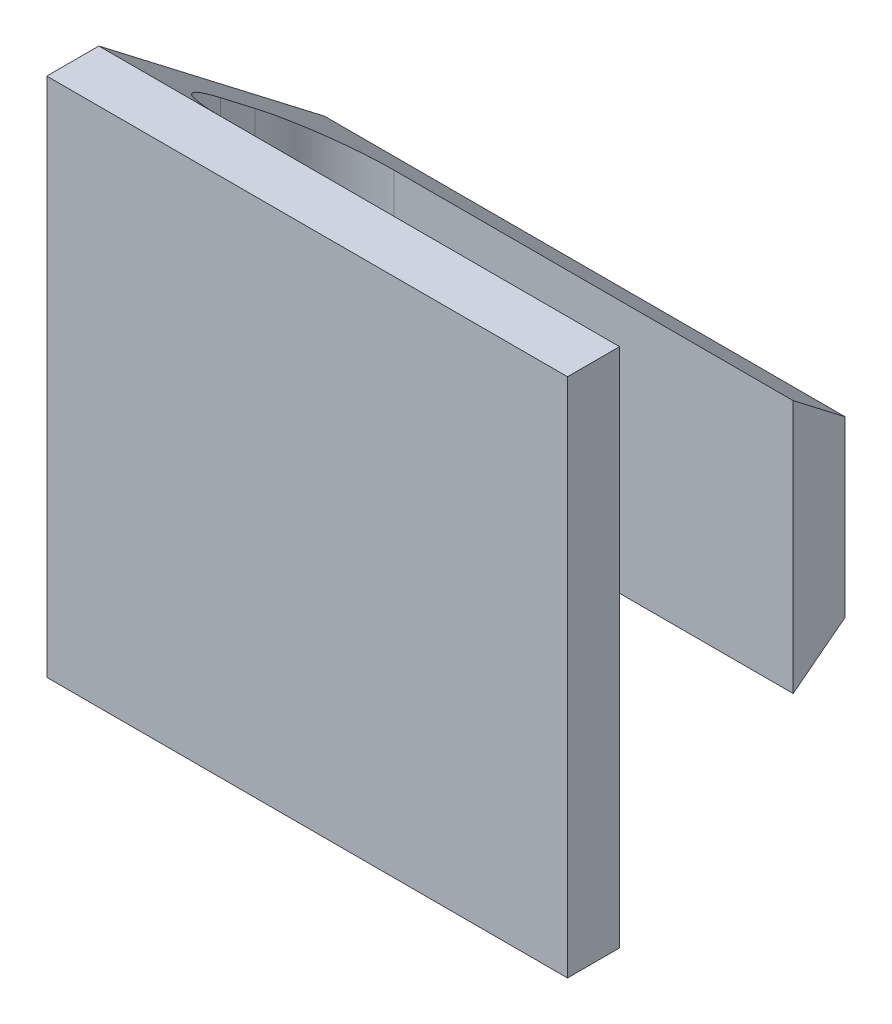
ISO-10303-21;
HEADER;
FILE_DESCRIPTION(('STEP AP214'),'2;1');
FILE_NAME('part.step','',(''),(''),'','','');
FILE_SCHEMA(('AUTOMOTIVE_DESIGN { 1 0 10303 214 1 1 1 1 }'));
ENDSEC;
DATA;
#1=APPLICATION_CONTEXT('core data for automotive mechanical design processes');
#2=APPLICATION_PROTOCOL_DEFINITION('international standard','automotive_design',2000,#1);
#3=PRODUCT_CONTEXT('',#1,'mechanical');
#4=PRODUCT('Part','Part','',(#3));
#5=PRODUCT_RELATED_PRODUCT_CATEGORY('part','',(#4));
#6=PRODUCT_DEFINITION_FORMATION('','',#4);
#7=PRODUCT_DEFINITION_CONTEXT('part definition',#1,'design');
#8=PRODUCT_DEFINITION('design','',#6,#7);
#9=PRODUCT_DEFINITION_SHAPE('','',#8);
#10=(LENGTH_UNIT() NAMED_UNIT(*) SI_UNIT(.MILLI.,.METRE.));
#11=(NAMED_UNIT(*) PLANE_ANGLE_UNIT() SI_UNIT($,.RADIAN.));
#12=(NAMED_UNIT(*) SI_UNIT($,.STERADIAN.) SOLID_ANGLE_UNIT());
#13=UNCERTAINTY_MEASURE_WITH_UNIT(LENGTH_MEASURE(1.E-05),#10,'distance_accuracy_value','');
#14=(GEOMETRIC_REPRESENTATION_CONTEXT(3) GLOBAL_UNCERTAINTY_ASSIGNED_CONTEXT((#13)) GLOBAL_UNIT_ASSIGNED_CONTEXT((#10,
#11,#12)) REPRESENTATION_CONTEXT('',''));
#15=CARTESIAN_POINT('',(0.,0.,0.));
#16=DIRECTION('',(0.,0.,1.));
#17=DIRECTION('',(1.,0.,0.));
#18=AXIS2_PLACEMENT_3D('',#15,#16,#17);
#19=CARTESIAN_POINT('',(-6.77549194991055,15.,3.18604651162791));
#20=DIRECTION('',(1.,0.,0.));
#21=DIRECTION('',(0.,0.,-1.));
#22=AXIS2_PLACEMENT_3D('',#19,#20,#21);
#23=PLANE('',#22);
#24=DIRECTION('',(0.,0.609710760849692,0.7926239891046));
#25=VECTOR('',#24,1.);
#26=CARTESIAN_POINT('',(-6.77549194991055,15.,3.18604651162791));
#27=LINE('',#26,#25);
#28=CARTESIAN_POINT('',(-6.77549194991055,10.,-3.31395348837209));
#29=VERTEX_POINT('',#28);
#30=CARTESIAN_POINT('',(-6.77549194991055,15.,3.18604651162791));
#31=VERTEX_POINT('',#30);
#32=EDGE_CURVE('E46',#29,#31,#27,.T.);
#33=ORIENTED_EDGE('',*,*,#32,.F.);
#34=DIRECTION('',(0.,-1.,0.));
#35=VECTOR('',#34,1.);
#36=CARTESIAN_POINT('',(-6.77549194991055,15.,-3.31395348837209));
#37=LINE('',#36,#35);
#38=CARTESIAN_POINT('',(-6.77549194991055,5.,-3.31395348837209));
#39=VERTEX_POINT('',#38);
#40=EDGE_CURVE('E133',#29,#39,#37,.T.);
#41=ORIENTED_EDGE('',*,*,#40,.T.);
#42=DIRECTION('',(0.,0.609710760849692,-0.7926239891046));
#43=VECTOR('',#42,1.);
#44=CARTESIAN_POINT('',(-6.77549194991055,5.57620817843866,-4.06302412034235));
#45=LINE('',#44,#43);
#46=CARTESIAN_POINT('',(-6.77549194991055,0.,3.18604651162791));
#47=VERTEX_POINT('',#46);
#48=EDGE_CURVE('E121',#47,#39,#45,.T.);
#49=ORIENTED_EDGE('',*,*,#48,.F.);
#50=DIRECTION('',(0.,0.,1.));
#51=VECTOR('',#50,1.);
#52=CARTESIAN_POINT('',(-6.77549194991055,0.,3.18604651162791));
#53=LINE('',#52,#51);
#54=CARTESIAN_POINT('',(-6.77549194991055,0.,4.68604651162791));
#55=VERTEX_POINT('',#54);
#56=EDGE_CURVE('E130',#47,#55,#53,.T.);
#57=ORIENTED_EDGE('',*,*,#56,.T.);
#58=DIRECTION('',(0.,-1.,0.));
#59=VECTOR('',#58,1.);
#60=CARTESIAN_POINT('',(-6.77549194991055,15.,4.68604651162791));
#61=LINE('',#60,#59);
#62=CARTESIAN_POINT('',(-6.77549194991055,15.,4.68604651162791));
#63=VERTEX_POINT('',#62);
#64=EDGE_CURVE('E127',#63,#55,#61,.T.);
#65=ORIENTED_EDGE('',*,*,#64,.F.);
#66=DIRECTION('',(0.,0.,1.));
#67=VECTOR('',#66,1.);
#68=CARTESIAN_POINT('',(-6.77549194991055,15.,-3.31395348837209));
#69=LINE('',#68,#67);
#70=EDGE_CURVE('E80',#31,#63,#69,.T.);
#71=ORIENTED_EDGE('',*,*,#70,.F.);
#72=EDGE_LOOP('',(#33,#41,#49,#57,#65,#71));
#73=FACE_BOUND('',#72,.T.);
#74=ADVANCED_FACE('F33',(#73),#23,.F.);
#75=CARTESIAN_POINT('',(-3.27549194991055,15.,1.18604651162791));
#76=DIRECTION('',(0.,-1.,0.));
#77=DIRECTION('',(0.,0.,-1.));
#78=AXIS2_PLACEMENT_3D('',#75,#76,#77);
#79=CYLINDRICAL_SURFACE('',#78,2.);
#80=CARTESIAN_POINT('',(-3.27549194991055,13.4615384615385,1.18604651162791));
#81=DIRECTION('',(0.,0.7926239891046,-0.609710760849692));
#82=DIRECTION('',(0.,-0.609710760849692,-0.7926239891046));
#83=AXIS2_PLACEMENT_3D('',#80,#81,#82);
#84=ELLIPSE('',#83,2.52326453336257,2.);
#85=CARTESIAN_POINT('',(-3.27549194991054,15.,3.18604651162791));
#86=VERTEX_POINT('',#85);
#87=CARTESIAN_POINT('',(-5.27549194991055,13.4615384615385,1.18604651162789));
#88=VERTEX_POINT('',#87);
#89=EDGE_CURVE('E143',#86,#88,#84,.F.);
#90=ORIENTED_EDGE('',*,*,#89,.F.);
#91=DIRECTION('',(0.,-1.,0.));
#92=VECTOR('',#91,1.);
#93=CARTESIAN_POINT('',(-3.27549194991054,15.,3.18604651162791));
#94=LINE('',#93,#92);
#95=CARTESIAN_POINT('',(-3.27549194991054,0.,3.18604651162791));
#96=VERTEX_POINT('',#95);
#97=EDGE_CURVE('E168',#86,#96,#94,.T.);
#98=ORIENTED_EDGE('',*,*,#97,.T.);
#99=CARTESIAN_POINT('',(-3.27549194991055,1.53846153846154,1.18604651162791));
#100=DIRECTION('',(0.,-0.7926239891046,-0.609710760849692));
#101=DIRECTION('',(0.,-0.609710760849692,0.7926239891046));
#102=AXIS2_PLACEMENT_3D('',#99,#100,#101);
#103=ELLIPSE('',#102,2.52326453336257,2.);
#104=CARTESIAN_POINT('',(-5.27549194991055,1.53846153846155,1.18604651162789));
#105=VERTEX_POINT('',#104);
#106=EDGE_CURVE('E76',#105,#96,#103,.F.);
#107=ORIENTED_EDGE('',*,*,#106,.F.);
#108=DIRECTION('',(0.,-1.,0.));
#109=VECTOR('',#108,1.);
#110=CARTESIAN_POINT('',(-5.27549194991055,15.,1.18604651162789));
#111=LINE('',#110,#109);
#112=EDGE_CURVE('E165',#88,#105,#111,.T.);
#113=ORIENTED_EDGE('',*,*,#112,.F.);
#114=EDGE_LOOP('',(#90,#98,#107,#113));
#115=FACE_BOUND('',#114,.T.);
#116=ADVANCED_FACE('F192',(#115),#79,.F.);
#117=CARTESIAN_POINT('',(-5.27549194991055,15.,0.186046511627921));
#118=DIRECTION('',(-1.,0.,0.));
#119=DIRECTION('',(0.,0.,1.));
#120=AXIS2_PLACEMENT_3D('',#117,#118,#119);
#121=PLANE('',#120);
#122=DIRECTION('',(0.,-0.609710760849692,-0.7926239891046));
#123=VECTOR('',#122,1.);
#124=CARTESIAN_POINT('',(-5.27549194991055,13.550185873606,1.30128814731565));
#125=LINE('',#124,#123);
#126=CARTESIAN_POINT('',(-5.27549194991055,12.6923076923077,0.186046511627921));
#127=VERTEX_POINT('',#126);
#128=EDGE_CURVE('E195',#88,#127,#125,.T.);
#129=ORIENTED_EDGE('',*,*,#128,.F.);
#130=ORIENTED_EDGE('',*,*,#112,.T.);
#131=DIRECTION('',(0.,-0.609710760849692,0.7926239891046));
#132=VECTOR('',#131,1.);
#133=CARTESIAN_POINT('',(-5.27549194991055,7.02602230483271,-5.94778248465461));
#134=LINE('',#133,#132);
#135=CARTESIAN_POINT('',(-5.27549194991055,2.3076923076923,0.186046511627921));
#136=VERTEX_POINT('',#135);
#137=EDGE_CURVE('E204',#136,#105,#134,.T.);
#138=ORIENTED_EDGE('',*,*,#137,.F.);
#139=DIRECTION('',(0.,-1.,0.));
#140=VECTOR('',#139,1.);
#141=CARTESIAN_POINT('',(-5.27549194991055,15.,0.186046511627921));
#142=LINE('',#141,#140);
#143=EDGE_CURVE('E162',#127,#136,#142,.T.);
#144=ORIENTED_EDGE('',*,*,#143,.F.);
#145=EDGE_LOOP('',(#129,#130,#138,#144));
#146=FACE_BOUND('',#145,.T.);
#147=ADVANCED_FACE('F236',(#146),#121,.F.);
#148=CARTESIAN_POINT('',(-3.27549194991055,15.,0.186046511627907));
#149=DIRECTION('',(0.,-1.,0.));
#150=DIRECTION('',(0.,0.,-1.));
#151=AXIS2_PLACEMENT_3D('',#148,#149,#150);
#152=CYLINDRICAL_SURFACE('',#151,2.);
#153=CARTESIAN_POINT('',(-3.27549194991055,12.6923076923077,0.186046511627907));
#154=DIRECTION('',(0.,0.7926239891046,-0.609710760849692));
#155=DIRECTION('',(0.,-0.609710760849692,-0.7926239891046));
#156=AXIS2_PLACEMENT_3D('',#153,#154,#155);
#157=ELLIPSE('',#156,2.52326453336257,2.);
#158=CARTESIAN_POINT('',(-3.27549194991054,11.1538461538462,-1.81395348837209));
#159=VERTEX_POINT('',#158);
#160=EDGE_CURVE('E196',#127,#159,#157,.F.);
#161=ORIENTED_EDGE('',*,*,#160,.F.);
#162=ORIENTED_EDGE('',*,*,#143,.T.);
#163=CARTESIAN_POINT('',(-3.27549194991055,2.30769230769231,0.186046511627907));
#164=DIRECTION('',(0.,-0.7926239891046,-0.609710760849692));
#165=DIRECTION('',(0.,-0.609710760849692,0.7926239891046));
#166=AXIS2_PLACEMENT_3D('',#163,#164,#165);
#167=ELLIPSE('',#166,2.52326453336257,2.);
#168=CARTESIAN_POINT('',(-3.27549194991054,3.84615384615385,-1.81395348837209));
#169=VERTEX_POINT('',#168);
#170=EDGE_CURVE('E206',#169,#136,#167,.F.);
#171=ORIENTED_EDGE('',*,*,#170,.F.);
#172=DIRECTION('',(0.,-1.,0.));
#173=VECTOR('',#172,1.);
#174=CARTESIAN_POINT('',(-3.27549194991054,15.,-1.81395348837209));
#175=LINE('',#174,#173);
#176=EDGE_CURVE('E159',#159,#169,#175,.T.);
#177=ORIENTED_EDGE('',*,*,#176,.F.);
#178=EDGE_LOOP('',(#161,#162,#171,#177));
#179=FACE_BOUND('',#178,.T.);
#180=ADVANCED_FACE('F233',(#179),#152,.F.);
#181=CARTESIAN_POINT('',(-3.27549194991054,15.,-1.81395348837209));
#182=DIRECTION('',(0.,0.,-1.));
#183=DIRECTION('',(-1.,0.,0.));
#184=AXIS2_PLACEMENT_3D('',#181,#182,#183);
#185=PLANE('',#184);
#186=DIRECTION('',(1.,0.,0.));
#187=VECTOR('',#186,1.);
#188=CARTESIAN_POINT('',(-3.27549194991054,11.1538461538462,-1.81395348837209));
#189=LINE('',#188,#187);
#190=CARTESIAN_POINT('',(8.22450805008945,11.1538461538462,-1.81395348837209));
#191=VERTEX_POINT('',#190);
#192=EDGE_CURVE('E200',#159,#191,#189,.T.);
#193=ORIENTED_EDGE('',*,*,#192,.F.);
#194=ORIENTED_EDGE('',*,*,#176,.T.);
#195=DIRECTION('',(-1.,0.,0.));
#196=VECTOR('',#195,1.);
#197=CARTESIAN_POINT('',(-3.27549194991054,3.84615384615385,-1.81395348837209));
#198=LINE('',#197,#196);
#199=CARTESIAN_POINT('',(8.22450805008945,3.84615384615385,-1.81395348837209));
#200=VERTEX_POINT('',#199);
#201=EDGE_CURVE('E208',#200,#169,#198,.T.);
#202=ORIENTED_EDGE('',*,*,#201,.F.);
#203=DIRECTION('',(0.,-1.,0.));
#204=VECTOR('',#203,1.);
#205=CARTESIAN_POINT('',(8.22450805008945,15.,-1.81395348837209));
#206=LINE('',#205,#204);
#207=EDGE_CURVE('E156',#191,#200,#206,.T.);
#208=ORIENTED_EDGE('',*,*,#207,.F.);
#209=EDGE_LOOP('',(#193,#194,#202,#208));
#210=FACE_BOUND('',#209,.T.);
#211=ADVANCED_FACE('F227',(#210),#185,.F.);
#212=CARTESIAN_POINT('',(8.22450805008945,15.,-3.31395348837209));
#213=DIRECTION('',(-1.,0.,0.));
#214=DIRECTION('',(0.,0.,1.));
#215=AXIS2_PLACEMENT_3D('',#212,#213,#214);
#216=PLANE('',#215);
#217=DIRECTION('',(0.,-0.609710760849692,-0.7926239891046));
#218=VECTOR('',#217,1.);
#219=CARTESIAN_POINT('',(8.22450805008945,11.8587360594796,-0.897596611048672));
#220=LINE('',#219,#218);
#221=CARTESIAN_POINT('',(8.22450805008945,10.,-3.31395348837209));
#222=VERTEX_POINT('',#221);
#223=EDGE_CURVE('E134',#191,#222,#220,.T.);
#224=ORIENTED_EDGE('',*,*,#223,.F.);
#225=ORIENTED_EDGE('',*,*,#207,.T.);
#226=DIRECTION('',(0.,-0.609710760849692,0.7926239891046));
#227=VECTOR('',#226,1.);
#228=CARTESIAN_POINT('',(8.22450805008945,8.71747211895911,-8.14666724301893));
#229=LINE('',#228,#227);
#230=CARTESIAN_POINT('',(8.22450805008945,5.,-3.31395348837209));
#231=VERTEX_POINT('',#230);
#232=EDGE_CURVE('E210',#231,#200,#229,.T.);
#233=ORIENTED_EDGE('',*,*,#232,.F.);
#234=DIRECTION('',(0.,-1.,0.));
#235=VECTOR('',#234,1.);
#236=CARTESIAN_POINT('',(8.22450805008945,15.,-3.31395348837209));
#237=LINE('',#236,#235);
#238=EDGE_CURVE('E153',#222,#231,#237,.T.);
#239=ORIENTED_EDGE('',*,*,#238,.F.);
#240=EDGE_LOOP('',(#224,#225,#233,#239));
#241=FACE_BOUND('',#240,.T.);
#242=ADVANCED_FACE('F223',(#241),#216,.F.);
#243=CARTESIAN_POINT('',(-6.77549194991055,15.,-3.31395348837209));
#244=DIRECTION('',(0.,0.,1.));
#245=DIRECTION('',(1.,0.,0.));
#246=AXIS2_PLACEMENT_3D('',#243,#244,#245);
#247=PLANE('',#246);
#248=DIRECTION('',(-1.,0.,0.));
#249=VECTOR('',#248,1.);
#250=CARTESIAN_POINT('',(15.,10.,-3.31395348837209));
#251=LINE('',#250,#249);
#252=EDGE_CURVE('E212',#222,#29,#251,.T.);
#253=ORIENTED_EDGE('',*,*,#252,.F.);
#254=ORIENTED_EDGE('',*,*,#238,.T.);
#255=DIRECTION('',(-1.,0.,0.));
#256=VECTOR('',#255,1.);
#257=CARTESIAN_POINT('',(15.,5.,-3.31395348837209));
#258=LINE('',#257,#256);
#259=EDGE_CURVE('E214',#231,#39,#258,.T.);
#260=ORIENTED_EDGE('',*,*,#259,.T.);
#261=ORIENTED_EDGE('',*,*,#40,.F.);
#262=EDGE_LOOP('',(#253,#254,#260,#261));
#263=FACE_BOUND('',#262,.T.);
#264=ADVANCED_FACE('F217',(#263),#247,.F.);
#265=CARTESIAN_POINT('',(-3.27549194991055,15.,1.18604651162791));
#266=DIRECTION('',(0.,-1.,0.));
#267=DIRECTION('',(0.,0.,-1.));
#268=AXIS2_PLACEMENT_3D('',#265,#266,#267);
#269=PLANE('',#268);
#270=DIRECTION('',(1.,0.,0.));
#271=VECTOR('',#270,1.);
#272=CARTESIAN_POINT('',(-3.27549194991055,15.,3.18604651162791));
#273=LINE('',#272,#271);
#274=EDGE_CURVE('E11',#31,#86,#273,.T.);
#275=ORIENTED_EDGE('',*,*,#274,.F.);
#276=ORIENTED_EDGE('',*,*,#70,.T.);
#277=DIRECTION('',(1.,0.,0.));
#278=VECTOR('',#277,1.);
#279=CARTESIAN_POINT('',(-6.77549194991055,15.,4.68604651162791));
#280=LINE('',#279,#278);
#281=CARTESIAN_POINT('',(8.22450805008945,15.,4.68604651162791));
#282=VERTEX_POINT('',#281);
#283=EDGE_CURVE('E181',#63,#282,#280,.T.);
#284=ORIENTED_EDGE('',*,*,#283,.T.);
#285=DIRECTION('',(0.,0.,-1.));
#286=VECTOR('',#285,1.);
#287=CARTESIAN_POINT('',(8.22450805008945,15.,3.18604651162791));
#288=LINE('',#287,#286);
#289=CARTESIAN_POINT('',(8.22450805008945,15.,3.18604651162791));
#290=VERTEX_POINT('',#289);
#291=EDGE_CURVE('E55',#282,#290,#288,.T.);
#292=ORIENTED_EDGE('',*,*,#291,.T.);
#293=DIRECTION('',(-1.,0.,0.));
#294=VECTOR('',#293,1.);
#295=CARTESIAN_POINT('',(-3.27549194991054,15.,3.18604651162791));
#296=LINE('',#295,#294);
#297=EDGE_CURVE('E146',#290,#86,#296,.T.);
#298=ORIENTED_EDGE('',*,*,#297,.T.);
#299=EDGE_LOOP('',(#275,#276,#284,#292,#298));
#300=FACE_BOUND('',#299,.T.);
#301=ADVANCED_FACE('F187',(#300),#269,.F.);
#302=CARTESIAN_POINT('',(-3.27549194991055,0.,1.18604651162791));
#303=DIRECTION('',(0.,-1.,0.));
#304=DIRECTION('',(0.,0.,-1.));
#305=AXIS2_PLACEMENT_3D('',#302,#303,#304);
#306=PLANE('',#305);
#307=ORIENTED_EDGE('',*,*,#56,.F.);
#308=DIRECTION('',(1.,0.,0.));
#309=VECTOR('',#308,1.);
#310=CARTESIAN_POINT('',(-3.27549194991055,0.,3.18604651162791));
#311=LINE('',#310,#309);
#312=EDGE_CURVE('E40',#47,#96,#311,.T.);
#313=ORIENTED_EDGE('',*,*,#312,.T.);
#314=DIRECTION('',(-1.,0.,0.));
#315=VECTOR('',#314,1.);
#316=CARTESIAN_POINT('',(-3.27549194991054,0.,3.18604651162791));
#317=LINE('',#316,#315);
#318=CARTESIAN_POINT('',(8.22450805008945,0.,3.18604651162791));
#319=VERTEX_POINT('',#318);
#320=EDGE_CURVE('E150',#319,#96,#317,.T.);
#321=ORIENTED_EDGE('',*,*,#320,.F.);
#322=DIRECTION('',(0.,0.,-1.));
#323=VECTOR('',#322,1.);
#324=CARTESIAN_POINT('',(8.22450805008945,0.,3.18604651162791));
#325=LINE('',#324,#323);
#326=CARTESIAN_POINT('',(8.22450805008945,0.,4.68604651162791));
#327=VERTEX_POINT('',#326);
#328=EDGE_CURVE('E141',#327,#319,#325,.T.);
#329=ORIENTED_EDGE('',*,*,#328,.F.);
#330=DIRECTION('',(1.,0.,0.));
#331=VECTOR('',#330,1.);
#332=CARTESIAN_POINT('',(-6.77549194991055,0.,4.68604651162791));
#333=LINE('',#332,#331);
#334=EDGE_CURVE('E139',#55,#327,#333,.T.);
#335=ORIENTED_EDGE('',*,*,#334,.F.);
#336=EDGE_LOOP('',(#307,#313,#321,#329,#335));
#337=FACE_BOUND('',#336,.T.);
#338=ADVANCED_FACE('F137',(#337),#306,.T.);
#339=CARTESIAN_POINT('',(-6.77549194991055,15.,4.68604651162791));
#340=DIRECTION('',(0.,0.,-1.));
#341=DIRECTION('',(-1.,0.,0.));
#342=AXIS2_PLACEMENT_3D('',#339,#340,#341);
#343=PLANE('',#342);
#344=ORIENTED_EDGE('',*,*,#334,.T.);
#345=DIRECTION('',(0.,-1.,0.));
#346=VECTOR('',#345,1.);
#347=CARTESIAN_POINT('',(8.22450805008945,15.,4.68604651162791));
#348=LINE('',#347,#346);
#349=EDGE_CURVE('E174',#282,#327,#348,.T.);
#350=ORIENTED_EDGE('',*,*,#349,.F.);
#351=ORIENTED_EDGE('',*,*,#283,.F.);
#352=ORIENTED_EDGE('',*,*,#64,.T.);
#353=EDGE_LOOP('',(#344,#350,#351,#352));
#354=FACE_BOUND('',#353,.T.);
#355=ADVANCED_FACE('F179',(#354),#343,.F.);
#356=CARTESIAN_POINT('',(8.22450805008945,15.,3.18604651162791));
#357=DIRECTION('',(-1.,0.,0.));
#358=DIRECTION('',(0.,0.,1.));
#359=AXIS2_PLACEMENT_3D('',#356,#357,#358);
#360=PLANE('',#359);
#361=ORIENTED_EDGE('',*,*,#328,.T.);
#362=DIRECTION('',(0.,-1.,0.));
#363=VECTOR('',#362,1.);
#364=CARTESIAN_POINT('',(8.22450805008945,15.,3.18604651162791));
#365=LINE('',#364,#363);
#366=EDGE_CURVE('E171',#290,#319,#365,.T.);
#367=ORIENTED_EDGE('',*,*,#366,.F.);
#368=ORIENTED_EDGE('',*,*,#291,.F.);
#369=ORIENTED_EDGE('',*,*,#349,.T.);
#370=EDGE_LOOP('',(#361,#367,#368,#369));
#371=FACE_BOUND('',#370,.T.);
#372=ADVANCED_FACE('F258',(#371),#360,.F.);
#373=CARTESIAN_POINT('',(-3.27549194991054,15.,3.18604651162791));
#374=DIRECTION('',(0.,0.,1.));
#375=DIRECTION('',(1.,0.,0.));
#376=AXIS2_PLACEMENT_3D('',#373,#374,#375);
#377=PLANE('',#376);
#378=ORIENTED_EDGE('',*,*,#320,.T.);
#379=ORIENTED_EDGE('',*,*,#97,.F.);
#380=ORIENTED_EDGE('',*,*,#297,.F.);
#381=ORIENTED_EDGE('',*,*,#366,.T.);
#382=EDGE_LOOP('',(#378,#379,#380,#381));
#383=FACE_BOUND('',#382,.T.);
#384=ADVANCED_FACE('F189',(#383),#377,.F.);
#385=CARTESIAN_POINT('',(15.,5.,-3.31395348837209));
#386=DIRECTION('',(0.,-0.7926239891046,-0.609710760849692));
#387=DIRECTION('',(0.,0.609710760849692,-0.7926239891046));
#388=AXIS2_PLACEMENT_3D('',#385,#386,#387);
#389=PLANE('',#388);
#390=ORIENTED_EDGE('',*,*,#48,.T.);
#391=ORIENTED_EDGE('',*,*,#259,.F.);
#392=ORIENTED_EDGE('',*,*,#232,.T.);
#393=ORIENTED_EDGE('',*,*,#201,.T.);
#394=ORIENTED_EDGE('',*,*,#170,.T.);
#395=ORIENTED_EDGE('',*,*,#137,.T.);
#396=ORIENTED_EDGE('',*,*,#106,.T.);
#397=ORIENTED_EDGE('',*,*,#312,.F.);
#398=EDGE_LOOP('',(#390,#391,#392,#393,#394,#395,#396,#397));
#399=FACE_BOUND('',#398,.T.);
#400=ADVANCED_FACE('F120',(#399),#389,.T.);
#401=CARTESIAN_POINT('',(15.,15.,3.18604651162791));
#402=DIRECTION('',(0.,0.7926239891046,-0.609710760849692));
#403=DIRECTION('',(0.,0.609710760849692,0.7926239891046));
#404=AXIS2_PLACEMENT_3D('',#401,#402,#403);
#405=PLANE('',#404);
#406=ORIENTED_EDGE('',*,*,#32,.T.);
#407=ORIENTED_EDGE('',*,*,#274,.T.);
#408=ORIENTED_EDGE('',*,*,#89,.T.);
#409=ORIENTED_EDGE('',*,*,#128,.T.);
#410=ORIENTED_EDGE('',*,*,#160,.T.);
#411=ORIENTED_EDGE('',*,*,#192,.T.);
#412=ORIENTED_EDGE('',*,*,#223,.T.);
#413=ORIENTED_EDGE('',*,*,#252,.T.);
#414=EDGE_LOOP('',(#406,#407,#408,#409,#410,#411,#412,#413));
#415=FACE_BOUND('',#414,.T.);
#416=ADVANCED_FACE('F237',(#415),#405,.T.);
#417=CLOSED_SHELL('',(#74,#116,#147,#180,#211,#242,#264,#301,#338,#355,#372,#384,#400,#416));
#418=MANIFOLD_SOLID_BREP('B2',#417);
#419=ADVANCED_BREP_SHAPE_REPRESENTATION('',(#18,#418),#14);
#420=SHAPE_DEFINITION_REPRESENTATION(#9,#419);
ENDSEC;
END-ISO-10303-21;
